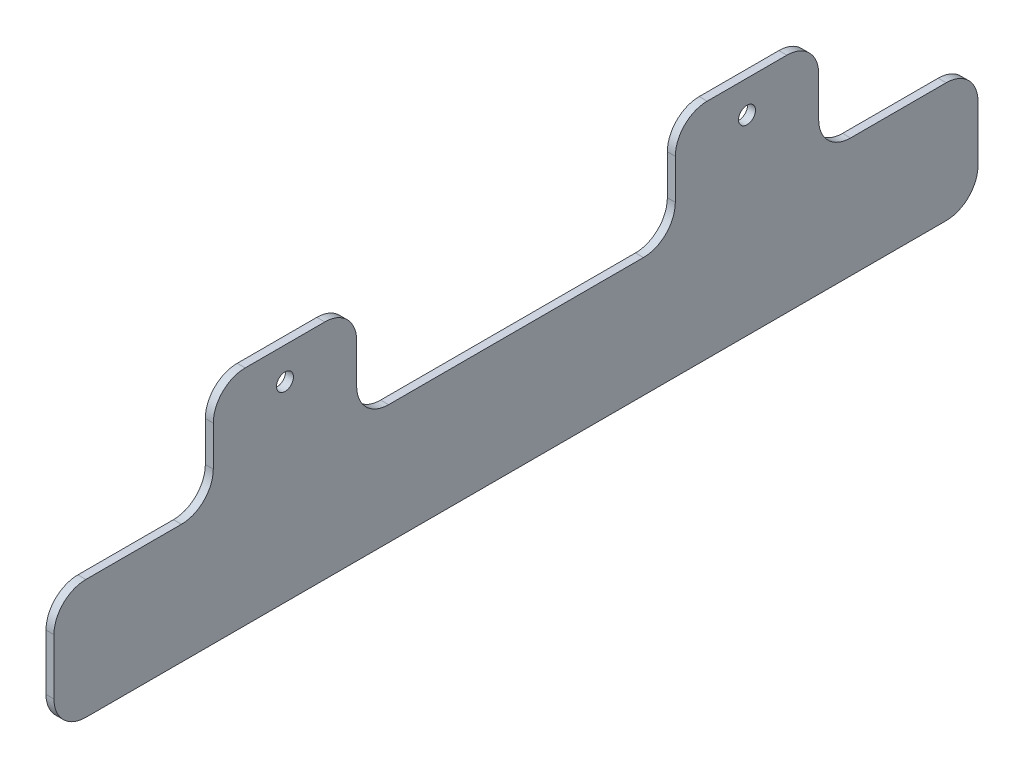
ISO-10303-21;
HEADER;
FILE_DESCRIPTION(('STEP AP214'),'2;1');
FILE_NAME('part.step','',(''),(''),'','','');
FILE_SCHEMA(('AUTOMOTIVE_DESIGN { 1 0 10303 214 1 1 1 1 }'));
ENDSEC;
DATA;
#1=APPLICATION_CONTEXT('core data for automotive mechanical design processes');
#2=APPLICATION_PROTOCOL_DEFINITION('international standard','automotive_design',2000,#1);
#3=PRODUCT_CONTEXT('',#1,'mechanical');
#4=PRODUCT('Part','Part','',(#3));
#5=PRODUCT_RELATED_PRODUCT_CATEGORY('part','',(#4));
#6=PRODUCT_DEFINITION_FORMATION('','',#4);
#7=PRODUCT_DEFINITION_CONTEXT('part definition',#1,'design');
#8=PRODUCT_DEFINITION('design','',#6,#7);
#9=PRODUCT_DEFINITION_SHAPE('','',#8);
#10=(LENGTH_UNIT() NAMED_UNIT(*) SI_UNIT(.MILLI.,.METRE.));
#11=(NAMED_UNIT(*) PLANE_ANGLE_UNIT() SI_UNIT($,.RADIAN.));
#12=(NAMED_UNIT(*) SI_UNIT($,.STERADIAN.) SOLID_ANGLE_UNIT());
#13=UNCERTAINTY_MEASURE_WITH_UNIT(LENGTH_MEASURE(1.E-05),#10,'distance_accuracy_value','');
#14=(GEOMETRIC_REPRESENTATION_CONTEXT(3) GLOBAL_UNCERTAINTY_ASSIGNED_CONTEXT((#13)) GLOBAL_UNIT_ASSIGNED_CONTEXT((#10,
#11,#12)) REPRESENTATION_CONTEXT('',''));
#15=CARTESIAN_POINT('',(0.,0.,0.));
#16=DIRECTION('',(0.,0.,1.));
#17=DIRECTION('',(1.,0.,0.));
#18=AXIS2_PLACEMENT_3D('',#15,#16,#17);
#19=CARTESIAN_POINT('',(3.175,12.7,-12.7));
#20=DIRECTION('',(-1.,0.,0.));
#21=DIRECTION('',(0.,0.,1.));
#22=AXIS2_PLACEMENT_3D('',#19,#20,#21);
#23=PLANE('',#22);
#24=CARTESIAN_POINT('',(3.175,12.7,-12.7));
#25=DIRECTION('',(1.,0.,0.));
#26=DIRECTION('',(0.,0.,1.));
#27=AXIS2_PLACEMENT_3D('',#24,#25,#26);
#28=CIRCLE('',#27,12.7);
#29=CARTESIAN_POINT('',(3.175,12.7,0.));
#30=VERTEX_POINT('',#29);
#31=CARTESIAN_POINT('',(3.175,0.,-12.7));
#32=VERTEX_POINT('',#31);
#33=EDGE_CURVE('E306',#30,#32,#28,.T.);
#34=ORIENTED_EDGE('',*,*,#33,.T.);
#35=DIRECTION('',(0.,0.,-1.));
#36=VECTOR('',#35,1.);
#37=CARTESIAN_POINT('',(3.175,0.,-12.7));
#38=LINE('',#37,#36);
#39=CARTESIAN_POINT('',(3.175,0.,-355.6));
#40=VERTEX_POINT('',#39);
#41=EDGE_CURVE('E145',#32,#40,#38,.T.);
#42=ORIENTED_EDGE('',*,*,#41,.T.);
#43=CARTESIAN_POINT('',(3.175,12.7,-355.6));
#44=DIRECTION('',(1.,0.,0.));
#45=DIRECTION('',(0.,0.,-1.));
#46=AXIS2_PLACEMENT_3D('',#43,#44,#45);
#47=CIRCLE('',#46,12.7);
#48=CARTESIAN_POINT('',(3.175,12.7,-368.3));
#49=VERTEX_POINT('',#48);
#50=EDGE_CURVE('E392',#40,#49,#47,.T.);
#51=ORIENTED_EDGE('',*,*,#50,.T.);
#52=DIRECTION('',(0.,1.,0.));
#53=VECTOR('',#52,1.);
#54=CARTESIAN_POINT('',(3.175,12.7,-368.3));
#55=LINE('',#54,#53);
#56=CARTESIAN_POINT('',(3.175,34.9250000000001,-368.3));
#57=VERTEX_POINT('',#56);
#58=EDGE_CURVE('E412',#49,#57,#55,.T.);
#59=ORIENTED_EDGE('',*,*,#58,.T.);
#60=CARTESIAN_POINT('',(3.175,34.9250000000001,-355.6));
#61=DIRECTION('',(1.,0.,0.));
#62=DIRECTION('',(0.,0.,-1.));
#63=AXIS2_PLACEMENT_3D('',#60,#61,#62);
#64=CIRCLE('',#63,12.7);
#65=CARTESIAN_POINT('',(3.175,47.625,-355.6));
#66=VERTEX_POINT('',#65);
#67=EDGE_CURVE('E408',#57,#66,#64,.T.);
#68=ORIENTED_EDGE('',*,*,#67,.T.);
#69=DIRECTION('',(0.,0.,1.));
#70=VECTOR('',#69,1.);
#71=CARTESIAN_POINT('',(3.175,47.6250000000001,-355.6));
#72=LINE('',#71,#70);
#73=CARTESIAN_POINT('',(3.175,47.6250000000001,-317.5));
#74=VERTEX_POINT('',#73);
#75=EDGE_CURVE('E411',#66,#74,#72,.T.);
#76=ORIENTED_EDGE('',*,*,#75,.T.);
#77=CARTESIAN_POINT('',(3.175,60.3250000000001,-317.5));
#78=DIRECTION('',(-1.,0.,0.));
#79=DIRECTION('',(0.,0.,1.));
#80=AXIS2_PLACEMENT_3D('',#77,#78,#79);
#81=CIRCLE('',#80,12.7);
#82=CARTESIAN_POINT('',(3.175,60.3250000000001,-304.8));
#83=VERTEX_POINT('',#82);
#84=EDGE_CURVE('E417',#74,#83,#81,.T.);
#85=ORIENTED_EDGE('',*,*,#84,.T.);
#86=DIRECTION('',(0.,1.,0.));
#87=VECTOR('',#86,1.);
#88=CARTESIAN_POINT('',(3.175,60.3250000000001,-304.8));
#89=LINE('',#88,#87);
#90=CARTESIAN_POINT('',(3.175,76.2,-304.8));
#91=VERTEX_POINT('',#90);
#92=EDGE_CURVE('E424',#83,#91,#89,.T.);
#93=ORIENTED_EDGE('',*,*,#92,.T.);
#94=CARTESIAN_POINT('',(3.175,76.2,-292.1));
#95=DIRECTION('',(1.,0.,0.));
#96=DIRECTION('',(0.,0.,-1.));
#97=AXIS2_PLACEMENT_3D('',#94,#95,#96);
#98=CIRCLE('',#97,12.7);
#99=CARTESIAN_POINT('',(3.175,88.9,-292.1));
#100=VERTEX_POINT('',#99);
#101=EDGE_CURVE('E427',#91,#100,#98,.T.);
#102=ORIENTED_EDGE('',*,*,#101,.T.);
#103=DIRECTION('',(0.,0.,1.));
#104=VECTOR('',#103,1.);
#105=CARTESIAN_POINT('',(3.175,88.9,-292.1));
#106=LINE('',#105,#104);
#107=CARTESIAN_POINT('',(3.175,88.9,-260.35));
#108=VERTEX_POINT('',#107);
#109=EDGE_CURVE('E430',#100,#108,#106,.T.);
#110=ORIENTED_EDGE('',*,*,#109,.T.);
#111=CARTESIAN_POINT('',(3.175,76.2,-260.35));
#112=DIRECTION('',(1.,0.,0.));
#113=DIRECTION('',(0.,0.,-1.));
#114=AXIS2_PLACEMENT_3D('',#111,#112,#113);
#115=CIRCLE('',#114,12.7);
#116=CARTESIAN_POINT('',(3.175,76.2,-247.65));
#117=VERTEX_POINT('',#116);
#118=EDGE_CURVE('E433',#108,#117,#115,.T.);
#119=ORIENTED_EDGE('',*,*,#118,.T.);
#120=DIRECTION('',(0.,-1.,0.));
#121=VECTOR('',#120,1.);
#122=CARTESIAN_POINT('',(3.175,76.2,-247.65));
#123=LINE('',#122,#121);
#124=CARTESIAN_POINT('',(3.175,60.3250000000001,-247.65));
#125=VERTEX_POINT('',#124);
#126=EDGE_CURVE('E436',#117,#125,#123,.T.);
#127=ORIENTED_EDGE('',*,*,#126,.T.);
#128=CARTESIAN_POINT('',(3.175,60.325,-234.95));
#129=DIRECTION('',(-1.,0.,0.));
#130=DIRECTION('',(0.,0.,1.));
#131=AXIS2_PLACEMENT_3D('',#128,#129,#130);
#132=CIRCLE('',#131,12.7);
#133=CARTESIAN_POINT('',(3.175,47.625,-234.95));
#134=VERTEX_POINT('',#133);
#135=EDGE_CURVE('E439',#125,#134,#132,.T.);
#136=ORIENTED_EDGE('',*,*,#135,.T.);
#137=DIRECTION('',(0.,0.,1.));
#138=VECTOR('',#137,1.);
#139=CARTESIAN_POINT('',(3.175,47.625,-133.35));
#140=LINE('',#139,#138);
#141=CARTESIAN_POINT('',(3.175,47.625,-133.35));
#142=VERTEX_POINT('',#141);
#143=EDGE_CURVE('E442',#134,#142,#140,.T.);
#144=ORIENTED_EDGE('',*,*,#143,.T.);
#145=CARTESIAN_POINT('',(3.175,60.325,-133.35));
#146=DIRECTION('',(-1.,0.,0.));
#147=DIRECTION('',(0.,0.,-1.));
#148=AXIS2_PLACEMENT_3D('',#145,#146,#147);
#149=CIRCLE('',#148,12.7);
#150=CARTESIAN_POINT('',(3.175,60.3250000000001,-120.65));
#151=VERTEX_POINT('',#150);
#152=EDGE_CURVE('E445',#142,#151,#149,.T.);
#153=ORIENTED_EDGE('',*,*,#152,.T.);
#154=DIRECTION('',(0.,1.,0.));
#155=VECTOR('',#154,1.);
#156=CARTESIAN_POINT('',(3.175,76.1999999999999,-120.65));
#157=LINE('',#156,#155);
#158=CARTESIAN_POINT('',(3.175,76.1999999999999,-120.65));
#159=VERTEX_POINT('',#158);
#160=EDGE_CURVE('E448',#151,#159,#157,.T.);
#161=ORIENTED_EDGE('',*,*,#160,.T.);
#162=CARTESIAN_POINT('',(3.175,76.2,-107.95));
#163=DIRECTION('',(1.,0.,0.));
#164=DIRECTION('',(0.,0.,-1.));
#165=AXIS2_PLACEMENT_3D('',#162,#163,#164);
#166=CIRCLE('',#165,12.7);
#167=CARTESIAN_POINT('',(3.175,88.9,-107.95));
#168=VERTEX_POINT('',#167);
#169=EDGE_CURVE('E451',#159,#168,#166,.T.);
#170=ORIENTED_EDGE('',*,*,#169,.T.);
#171=DIRECTION('',(0.,0.,1.));
#172=VECTOR('',#171,1.);
#173=CARTESIAN_POINT('',(3.175,88.9,-107.95));
#174=LINE('',#173,#172);
#175=CARTESIAN_POINT('',(3.175,88.9,-76.2));
#176=VERTEX_POINT('',#175);
#177=EDGE_CURVE('E454',#168,#176,#174,.T.);
#178=ORIENTED_EDGE('',*,*,#177,.T.);
#179=CARTESIAN_POINT('',(3.175,76.2,-76.2));
#180=DIRECTION('',(1.,0.,0.));
#181=DIRECTION('',(0.,0.,-1.));
#182=AXIS2_PLACEMENT_3D('',#179,#180,#181);
#183=CIRCLE('',#182,12.7);
#184=CARTESIAN_POINT('',(3.175,76.2,-63.5));
#185=VERTEX_POINT('',#184);
#186=EDGE_CURVE('E457',#176,#185,#183,.T.);
#187=ORIENTED_EDGE('',*,*,#186,.T.);
#188=DIRECTION('',(0.,-1.,0.));
#189=VECTOR('',#188,1.);
#190=CARTESIAN_POINT('',(3.175,76.2,-63.5));
#191=LINE('',#190,#189);
#192=CARTESIAN_POINT('',(3.175,60.325,-63.5));
#193=VERTEX_POINT('',#192);
#194=EDGE_CURVE('E460',#185,#193,#191,.T.);
#195=ORIENTED_EDGE('',*,*,#194,.T.);
#196=CARTESIAN_POINT('',(3.175,60.325,-50.8));
#197=DIRECTION('',(-1.,0.,0.));
#198=DIRECTION('',(0.,0.,1.));
#199=AXIS2_PLACEMENT_3D('',#196,#197,#198);
#200=CIRCLE('',#199,12.7);
#201=CARTESIAN_POINT('',(3.175,47.625,-50.8));
#202=VERTEX_POINT('',#201);
#203=EDGE_CURVE('E212',#193,#202,#200,.T.);
#204=ORIENTED_EDGE('',*,*,#203,.T.);
#205=DIRECTION('',(0.,0.,1.));
#206=VECTOR('',#205,1.);
#207=CARTESIAN_POINT('',(3.175,47.625,-50.8));
#208=LINE('',#207,#206);
#209=CARTESIAN_POINT('',(3.175,47.625,-12.7));
#210=VERTEX_POINT('',#209);
#211=EDGE_CURVE('E206',#202,#210,#208,.T.);
#212=ORIENTED_EDGE('',*,*,#211,.T.);
#213=CARTESIAN_POINT('',(3.175,34.925,-12.7));
#214=DIRECTION('',(1.,0.,0.));
#215=DIRECTION('',(0.,0.,-1.));
#216=AXIS2_PLACEMENT_3D('',#213,#214,#215);
#217=CIRCLE('',#216,12.7);
#218=CARTESIAN_POINT('',(3.175,34.925,0.));
#219=VERTEX_POINT('',#218);
#220=EDGE_CURVE('E210',#210,#219,#217,.T.);
#221=ORIENTED_EDGE('',*,*,#220,.T.);
#222=DIRECTION('',(0.,-1.,0.));
#223=VECTOR('',#222,1.);
#224=CARTESIAN_POINT('',(3.175,34.925,0.));
#225=LINE('',#224,#223);
#226=EDGE_CURVE('E54',#219,#30,#225,.T.);
#227=ORIENTED_EDGE('',*,*,#226,.T.);
#228=EDGE_LOOP('',(#34,#42,#51,#59,#68,#76,#85,#93,#102,#110,#119,#127,#136,#144,#153,#161,#170,
#178,#187,#195,#204,#212,#221,#227));
#229=FACE_BOUND('',#228,.T.);
#230=CARTESIAN_POINT('',(3.175,76.2,-92.075));
#231=DIRECTION('',(1.,0.,0.));
#232=DIRECTION('',(0.,0.,-1.));
#233=AXIS2_PLACEMENT_3D('',#230,#231,#232);
#234=CIRCLE('',#233,3.37343749999999);
#235=CARTESIAN_POINT('',(3.175,76.2,-95.4484375));
#236=VERTEX_POINT('',#235);
#237=EDGE_CURVE('E240',#236,#236,#234,.T.);
#238=ORIENTED_EDGE('',*,*,#237,.F.);
#239=EDGE_LOOP('',(#238));
#240=FACE_BOUND('',#239,.T.);
#241=CARTESIAN_POINT('',(3.175,76.2,-276.225));
#242=DIRECTION('',(1.,0.,0.));
#243=DIRECTION('',(0.,0.,-1.));
#244=AXIS2_PLACEMENT_3D('',#241,#242,#243);
#245=CIRCLE('',#244,3.37343750000003);
#246=CARTESIAN_POINT('',(3.175,76.2,-279.5984375));
#247=VERTEX_POINT('',#246);
#248=EDGE_CURVE('E520',#247,#247,#245,.T.);
#249=ORIENTED_EDGE('',*,*,#248,.F.);
#250=EDGE_LOOP('',(#249));
#251=FACE_BOUND('',#250,.T.);
#252=ADVANCED_FACE('F36',(#229,#240,#251),#23,.F.);
#253=CARTESIAN_POINT('',(0.,12.7,-12.7));
#254=DIRECTION('',(-1.,0.,0.));
#255=DIRECTION('',(0.,0.,1.));
#256=AXIS2_PLACEMENT_3D('',#253,#254,#255);
#257=PLANE('',#256);
#258=CARTESIAN_POINT('',(0.,76.2,-92.075));
#259=DIRECTION('',(1.,0.,0.));
#260=DIRECTION('',(0.,0.,-1.));
#261=AXIS2_PLACEMENT_3D('',#258,#259,#260);
#262=CIRCLE('',#261,3.37343749999999);
#263=CARTESIAN_POINT('',(0.,76.2,-95.4484375));
#264=VERTEX_POINT('',#263);
#265=EDGE_CURVE('E528',#264,#264,#262,.T.);
#266=ORIENTED_EDGE('',*,*,#265,.T.);
#267=EDGE_LOOP('',(#266));
#268=FACE_BOUND('',#267,.T.);
#269=CARTESIAN_POINT('',(0.,12.7,-12.7));
#270=DIRECTION('',(1.,0.,0.));
#271=DIRECTION('',(0.,0.,1.));
#272=AXIS2_PLACEMENT_3D('',#269,#270,#271);
#273=CIRCLE('',#272,12.7);
#274=CARTESIAN_POINT('',(0.,12.7,0.));
#275=VERTEX_POINT('',#274);
#276=CARTESIAN_POINT('',(0.,0.,-12.7));
#277=VERTEX_POINT('',#276);
#278=EDGE_CURVE('E235',#275,#277,#273,.T.);
#279=ORIENTED_EDGE('',*,*,#278,.F.);
#280=DIRECTION('',(0.,-1.,0.));
#281=VECTOR('',#280,1.);
#282=CARTESIAN_POINT('',(0.,34.925,0.));
#283=LINE('',#282,#281);
#284=CARTESIAN_POINT('',(0.,34.925,0.));
#285=VERTEX_POINT('',#284);
#286=EDGE_CURVE('E137',#285,#275,#283,.T.);
#287=ORIENTED_EDGE('',*,*,#286,.F.);
#288=CARTESIAN_POINT('',(0.,34.925,-12.7));
#289=DIRECTION('',(1.,0.,0.));
#290=DIRECTION('',(0.,0.,-1.));
#291=AXIS2_PLACEMENT_3D('',#288,#289,#290);
#292=CIRCLE('',#291,12.7);
#293=CARTESIAN_POINT('',(0.,47.625,-12.7));
#294=VERTEX_POINT('',#293);
#295=EDGE_CURVE('E131',#294,#285,#292,.T.);
#296=ORIENTED_EDGE('',*,*,#295,.F.);
#297=DIRECTION('',(0.,0.,1.));
#298=VECTOR('',#297,1.);
#299=CARTESIAN_POINT('',(0.,47.625,-50.8));
#300=LINE('',#299,#298);
#301=CARTESIAN_POINT('',(0.,47.625,-50.8));
#302=VERTEX_POINT('',#301);
#303=EDGE_CURVE('E221',#302,#294,#300,.T.);
#304=ORIENTED_EDGE('',*,*,#303,.F.);
#305=CARTESIAN_POINT('',(0.,60.325,-50.8));
#306=DIRECTION('',(-1.,0.,0.));
#307=DIRECTION('',(0.,0.,1.));
#308=AXIS2_PLACEMENT_3D('',#305,#306,#307);
#309=CIRCLE('',#308,12.7);
#310=CARTESIAN_POINT('',(0.,60.325,-63.5));
#311=VERTEX_POINT('',#310);
#312=EDGE_CURVE('E297',#311,#302,#309,.T.);
#313=ORIENTED_EDGE('',*,*,#312,.F.);
#314=DIRECTION('',(0.,-1.,0.));
#315=VECTOR('',#314,1.);
#316=CARTESIAN_POINT('',(0.,76.2,-63.5));
#317=LINE('',#316,#315);
#318=CARTESIAN_POINT('',(0.,76.2,-63.5));
#319=VERTEX_POINT('',#318);
#320=EDGE_CURVE('E294',#319,#311,#317,.T.);
#321=ORIENTED_EDGE('',*,*,#320,.F.);
#322=CARTESIAN_POINT('',(0.,76.2,-76.2));
#323=DIRECTION('',(1.,0.,0.));
#324=DIRECTION('',(0.,0.,-1.));
#325=AXIS2_PLACEMENT_3D('',#322,#323,#324);
#326=CIRCLE('',#325,12.7);
#327=CARTESIAN_POINT('',(0.,88.9,-76.2));
#328=VERTEX_POINT('',#327);
#329=EDGE_CURVE('E291',#328,#319,#326,.T.);
#330=ORIENTED_EDGE('',*,*,#329,.F.);
#331=DIRECTION('',(0.,0.,1.));
#332=VECTOR('',#331,1.);
#333=CARTESIAN_POINT('',(0.,88.9,-107.95));
#334=LINE('',#333,#332);
#335=CARTESIAN_POINT('',(0.,88.9,-107.95));
#336=VERTEX_POINT('',#335);
#337=EDGE_CURVE('E288',#336,#328,#334,.T.);
#338=ORIENTED_EDGE('',*,*,#337,.F.);
#339=CARTESIAN_POINT('',(0.,76.2,-107.95));
#340=DIRECTION('',(1.,0.,0.));
#341=DIRECTION('',(0.,0.,-1.));
#342=AXIS2_PLACEMENT_3D('',#339,#340,#341);
#343=CIRCLE('',#342,12.7);
#344=CARTESIAN_POINT('',(0.,76.1999999999999,-120.65));
#345=VERTEX_POINT('',#344);
#346=EDGE_CURVE('E285',#345,#336,#343,.T.);
#347=ORIENTED_EDGE('',*,*,#346,.F.);
#348=DIRECTION('',(0.,1.,0.));
#349=VECTOR('',#348,1.);
#350=CARTESIAN_POINT('',(0.,76.1999999999999,-120.65));
#351=LINE('',#350,#349);
#352=CARTESIAN_POINT('',(0.,60.3250000000001,-120.65));
#353=VERTEX_POINT('',#352);
#354=EDGE_CURVE('E282',#353,#345,#351,.T.);
#355=ORIENTED_EDGE('',*,*,#354,.F.);
#356=CARTESIAN_POINT('',(0.,60.325,-133.35));
#357=DIRECTION('',(-1.,0.,0.));
#358=DIRECTION('',(0.,0.,-1.));
#359=AXIS2_PLACEMENT_3D('',#356,#357,#358);
#360=CIRCLE('',#359,12.7);
#361=CARTESIAN_POINT('',(0.,47.625,-133.35));
#362=VERTEX_POINT('',#361);
#363=EDGE_CURVE('E279',#362,#353,#360,.T.);
#364=ORIENTED_EDGE('',*,*,#363,.F.);
#365=DIRECTION('',(0.,0.,1.));
#366=VECTOR('',#365,1.);
#367=CARTESIAN_POINT('',(0.,47.625,-133.35));
#368=LINE('',#367,#366);
#369=CARTESIAN_POINT('',(0.,47.625,-234.95));
#370=VERTEX_POINT('',#369);
#371=EDGE_CURVE('E276',#370,#362,#368,.T.);
#372=ORIENTED_EDGE('',*,*,#371,.F.);
#373=CARTESIAN_POINT('',(0.,60.325,-234.95));
#374=DIRECTION('',(-1.,0.,0.));
#375=DIRECTION('',(0.,0.,1.));
#376=AXIS2_PLACEMENT_3D('',#373,#374,#375);
#377=CIRCLE('',#376,12.7);
#378=CARTESIAN_POINT('',(0.,60.3250000000001,-247.65));
#379=VERTEX_POINT('',#378);
#380=EDGE_CURVE('E273',#379,#370,#377,.T.);
#381=ORIENTED_EDGE('',*,*,#380,.F.);
#382=DIRECTION('',(0.,-1.,0.));
#383=VECTOR('',#382,1.);
#384=CARTESIAN_POINT('',(0.,76.2,-247.65));
#385=LINE('',#384,#383);
#386=CARTESIAN_POINT('',(0.,76.2,-247.65));
#387=VERTEX_POINT('',#386);
#388=EDGE_CURVE('E270',#387,#379,#385,.T.);
#389=ORIENTED_EDGE('',*,*,#388,.F.);
#390=CARTESIAN_POINT('',(0.,76.2,-260.35));
#391=DIRECTION('',(1.,0.,0.));
#392=DIRECTION('',(0.,0.,-1.));
#393=AXIS2_PLACEMENT_3D('',#390,#391,#392);
#394=CIRCLE('',#393,12.7);
#395=CARTESIAN_POINT('',(0.,88.9,-260.35));
#396=VERTEX_POINT('',#395);
#397=EDGE_CURVE('E267',#396,#387,#394,.T.);
#398=ORIENTED_EDGE('',*,*,#397,.F.);
#399=DIRECTION('',(0.,0.,1.));
#400=VECTOR('',#399,1.);
#401=CARTESIAN_POINT('',(0.,88.9,-292.1));
#402=LINE('',#401,#400);
#403=CARTESIAN_POINT('',(0.,88.9,-292.1));
#404=VERTEX_POINT('',#403);
#405=EDGE_CURVE('E264',#404,#396,#402,.T.);
#406=ORIENTED_EDGE('',*,*,#405,.F.);
#407=CARTESIAN_POINT('',(0.,76.2,-292.1));
#408=DIRECTION('',(1.,0.,0.));
#409=DIRECTION('',(0.,0.,-1.));
#410=AXIS2_PLACEMENT_3D('',#407,#408,#409);
#411=CIRCLE('',#410,12.7);
#412=CARTESIAN_POINT('',(0.,76.2,-304.8));
#413=VERTEX_POINT('',#412);
#414=EDGE_CURVE('E261',#413,#404,#411,.T.);
#415=ORIENTED_EDGE('',*,*,#414,.F.);
#416=DIRECTION('',(0.,1.,0.));
#417=VECTOR('',#416,1.);
#418=CARTESIAN_POINT('',(0.,60.3250000000001,-304.8));
#419=LINE('',#418,#417);
#420=CARTESIAN_POINT('',(0.,60.3250000000001,-304.8));
#421=VERTEX_POINT('',#420);
#422=EDGE_CURVE('E258',#421,#413,#419,.T.);
#423=ORIENTED_EDGE('',*,*,#422,.F.);
#424=CARTESIAN_POINT('',(0.,60.3250000000001,-317.5));
#425=DIRECTION('',(-1.,0.,0.));
#426=DIRECTION('',(0.,0.,1.));
#427=AXIS2_PLACEMENT_3D('',#424,#425,#426);
#428=CIRCLE('',#427,12.7);
#429=CARTESIAN_POINT('',(0.,47.6250000000001,-317.5));
#430=VERTEX_POINT('',#429);
#431=EDGE_CURVE('E255',#430,#421,#428,.T.);
#432=ORIENTED_EDGE('',*,*,#431,.F.);
#433=DIRECTION('',(0.,0.,1.));
#434=VECTOR('',#433,1.);
#435=CARTESIAN_POINT('',(0.,47.6250000000001,-355.6));
#436=LINE('',#435,#434);
#437=CARTESIAN_POINT('',(0.,47.625,-355.6));
#438=VERTEX_POINT('',#437);
#439=EDGE_CURVE('E252',#438,#430,#436,.T.);
#440=ORIENTED_EDGE('',*,*,#439,.F.);
#441=CARTESIAN_POINT('',(0.,34.9250000000001,-355.6));
#442=DIRECTION('',(1.,0.,0.));
#443=DIRECTION('',(0.,0.,-1.));
#444=AXIS2_PLACEMENT_3D('',#441,#442,#443);
#445=CIRCLE('',#444,12.7);
#446=CARTESIAN_POINT('',(0.,34.9250000000001,-368.3));
#447=VERTEX_POINT('',#446);
#448=EDGE_CURVE('E249',#447,#438,#445,.T.);
#449=ORIENTED_EDGE('',*,*,#448,.F.);
#450=DIRECTION('',(0.,1.,0.));
#451=VECTOR('',#450,1.);
#452=CARTESIAN_POINT('',(0.,12.7,-368.3));
#453=LINE('',#452,#451);
#454=CARTESIAN_POINT('',(0.,12.7,-368.3));
#455=VERTEX_POINT('',#454);
#456=EDGE_CURVE('E246',#455,#447,#453,.T.);
#457=ORIENTED_EDGE('',*,*,#456,.F.);
#458=CARTESIAN_POINT('',(0.,12.7,-355.6));
#459=DIRECTION('',(1.,0.,0.));
#460=DIRECTION('',(0.,0.,-1.));
#461=AXIS2_PLACEMENT_3D('',#458,#459,#460);
#462=CIRCLE('',#461,12.7);
#463=CARTESIAN_POINT('',(0.,0.,-355.6));
#464=VERTEX_POINT('',#463);
#465=EDGE_CURVE('E243',#464,#455,#462,.T.);
#466=ORIENTED_EDGE('',*,*,#465,.F.);
#467=DIRECTION('',(0.,0.,-1.));
#468=VECTOR('',#467,1.);
#469=CARTESIAN_POINT('',(0.,0.,-12.7));
#470=LINE('',#469,#468);
#471=EDGE_CURVE('E239',#277,#464,#470,.T.);
#472=ORIENTED_EDGE('',*,*,#471,.F.);
#473=EDGE_LOOP('',(#279,#287,#296,#304,#313,#321,#330,#338,#347,#355,#364,#372,#381,#389,#398,
#406,#415,#423,#432,#440,#449,#457,#466,#472));
#474=FACE_BOUND('',#473,.T.);
#475=CARTESIAN_POINT('',(0.,76.2,-276.225));
#476=DIRECTION('',(1.,0.,0.));
#477=DIRECTION('',(0.,0.,-1.));
#478=AXIS2_PLACEMENT_3D('',#475,#476,#477);
#479=CIRCLE('',#478,3.37343750000003);
#480=CARTESIAN_POINT('',(0.,76.2,-279.5984375));
#481=VERTEX_POINT('',#480);
#482=EDGE_CURVE('E523',#481,#481,#479,.T.);
#483=ORIENTED_EDGE('',*,*,#482,.T.);
#484=EDGE_LOOP('',(#483));
#485=FACE_BOUND('',#484,.T.);
#486=ADVANCED_FACE('F396',(#268,#474,#485),#257,.T.);
#487=CARTESIAN_POINT('',(3.175,12.7,-12.7));
#488=DIRECTION('',(-1.,0.,0.));
#489=DIRECTION('',(0.,0.,1.));
#490=AXIS2_PLACEMENT_3D('',#487,#488,#489);
#491=CYLINDRICAL_SURFACE('',#490,12.7);
#492=ORIENTED_EDGE('',*,*,#278,.T.);
#493=DIRECTION('',(-1.,0.,0.));
#494=VECTOR('',#493,1.);
#495=CARTESIAN_POINT('',(3.175,0.,-12.7));
#496=LINE('',#495,#494);
#497=EDGE_CURVE('E11',#32,#277,#496,.T.);
#498=ORIENTED_EDGE('',*,*,#497,.F.);
#499=ORIENTED_EDGE('',*,*,#33,.F.);
#500=DIRECTION('',(-1.,0.,0.));
#501=VECTOR('',#500,1.);
#502=CARTESIAN_POINT('',(3.175,12.7,0.));
#503=LINE('',#502,#501);
#504=EDGE_CURVE('E231',#30,#275,#503,.T.);
#505=ORIENTED_EDGE('',*,*,#504,.T.);
#506=EDGE_LOOP('',(#492,#498,#499,#505));
#507=FACE_BOUND('',#506,.T.);
#508=ADVANCED_FACE('F38',(#507),#491,.T.);
#509=CARTESIAN_POINT('',(3.175,0.,-12.7));
#510=DIRECTION('',(0.,1.,0.));
#511=DIRECTION('',(0.,0.,1.));
#512=AXIS2_PLACEMENT_3D('',#509,#510,#511);
#513=PLANE('',#512);
#514=ORIENTED_EDGE('',*,*,#471,.T.);
#515=DIRECTION('',(-1.,0.,0.));
#516=VECTOR('',#515,1.);
#517=CARTESIAN_POINT('',(3.175,0.,-355.6));
#518=LINE('',#517,#516);
#519=EDGE_CURVE('E46',#40,#464,#518,.T.);
#520=ORIENTED_EDGE('',*,*,#519,.F.);
#521=ORIENTED_EDGE('',*,*,#41,.F.);
#522=ORIENTED_EDGE('',*,*,#497,.T.);
#523=EDGE_LOOP('',(#514,#520,#521,#522));
#524=FACE_BOUND('',#523,.T.);
#525=ADVANCED_FACE('F779',(#524),#513,.F.);
#526=CARTESIAN_POINT('',(3.175,12.7,-355.6));
#527=DIRECTION('',(-1.,0.,0.));
#528=DIRECTION('',(0.,0.,1.));
#529=AXIS2_PLACEMENT_3D('',#526,#527,#528);
#530=CYLINDRICAL_SURFACE('',#529,12.7);
#531=ORIENTED_EDGE('',*,*,#465,.T.);
#532=DIRECTION('',(-1.,0.,0.));
#533=VECTOR('',#532,1.);
#534=CARTESIAN_POINT('',(3.175,12.7,-368.3));
#535=LINE('',#534,#533);
#536=EDGE_CURVE('E381',#49,#455,#535,.T.);
#537=ORIENTED_EDGE('',*,*,#536,.F.);
#538=ORIENTED_EDGE('',*,*,#50,.F.);
#539=ORIENTED_EDGE('',*,*,#519,.T.);
#540=EDGE_LOOP('',(#531,#537,#538,#539));
#541=FACE_BOUND('',#540,.T.);
#542=ADVANCED_FACE('F390',(#541),#530,.T.);
#543=CARTESIAN_POINT('',(3.175,12.7,-368.3));
#544=DIRECTION('',(0.,0.,1.));
#545=DIRECTION('',(0.,-1.,0.));
#546=AXIS2_PLACEMENT_3D('',#543,#544,#545);
#547=PLANE('',#546);
#548=ORIENTED_EDGE('',*,*,#456,.T.);
#549=DIRECTION('',(-1.,0.,0.));
#550=VECTOR('',#549,1.);
#551=CARTESIAN_POINT('',(3.175,34.9250000000001,-368.3));
#552=LINE('',#551,#550);
#553=EDGE_CURVE('E377',#57,#447,#552,.T.);
#554=ORIENTED_EDGE('',*,*,#553,.F.);
#555=ORIENTED_EDGE('',*,*,#58,.F.);
#556=ORIENTED_EDGE('',*,*,#536,.T.);
#557=EDGE_LOOP('',(#548,#554,#555,#556));
#558=FACE_BOUND('',#557,.T.);
#559=ADVANCED_FACE('F402',(#558),#547,.F.);
#560=CARTESIAN_POINT('',(3.175,34.9250000000001,-355.6));
#561=DIRECTION('',(-1.,0.,0.));
#562=DIRECTION('',(0.,0.,1.));
#563=AXIS2_PLACEMENT_3D('',#560,#561,#562);
#564=CYLINDRICAL_SURFACE('',#563,12.7);
#565=ORIENTED_EDGE('',*,*,#448,.T.);
#566=DIRECTION('',(-1.,0.,0.));
#567=VECTOR('',#566,1.);
#568=CARTESIAN_POINT('',(3.175,47.625,-355.6));
#569=LINE('',#568,#567);
#570=EDGE_CURVE('E373',#66,#438,#569,.T.);
#571=ORIENTED_EDGE('',*,*,#570,.F.);
#572=ORIENTED_EDGE('',*,*,#67,.F.);
#573=ORIENTED_EDGE('',*,*,#553,.T.);
#574=EDGE_LOOP('',(#565,#571,#572,#573));
#575=FACE_BOUND('',#574,.T.);
#576=ADVANCED_FACE('F406',(#575),#564,.T.);
#577=CARTESIAN_POINT('',(3.175,47.6250000000001,-355.6));
#578=DIRECTION('',(0.,-1.,0.));
#579=DIRECTION('',(0.,0.,-1.));
#580=AXIS2_PLACEMENT_3D('',#577,#578,#579);
#581=PLANE('',#580);
#582=ORIENTED_EDGE('',*,*,#439,.T.);
#583=DIRECTION('',(-1.,0.,0.));
#584=VECTOR('',#583,1.);
#585=CARTESIAN_POINT('',(3.175,47.6250000000001,-317.5));
#586=LINE('',#585,#584);
#587=EDGE_CURVE('E369',#74,#430,#586,.T.);
#588=ORIENTED_EDGE('',*,*,#587,.F.);
#589=ORIENTED_EDGE('',*,*,#75,.F.);
#590=ORIENTED_EDGE('',*,*,#570,.T.);
#591=EDGE_LOOP('',(#582,#588,#589,#590));
#592=FACE_BOUND('',#591,.T.);
#593=ADVANCED_FACE('F744',(#592),#581,.F.);
#594=CARTESIAN_POINT('',(3.175,60.3250000000001,-317.5));
#595=DIRECTION('',(-1.,0.,0.));
#596=DIRECTION('',(0.,0.,1.));
#597=AXIS2_PLACEMENT_3D('',#594,#595,#596);
#598=CYLINDRICAL_SURFACE('',#597,12.7);
#599=ORIENTED_EDGE('',*,*,#431,.T.);
#600=DIRECTION('',(-1.,0.,0.));
#601=VECTOR('',#600,1.);
#602=CARTESIAN_POINT('',(3.175,60.3250000000001,-304.8));
#603=LINE('',#602,#601);
#604=EDGE_CURVE('E365',#83,#421,#603,.T.);
#605=ORIENTED_EDGE('',*,*,#604,.F.);
#606=ORIENTED_EDGE('',*,*,#84,.F.);
#607=ORIENTED_EDGE('',*,*,#587,.T.);
#608=EDGE_LOOP('',(#599,#605,#606,#607));
#609=FACE_BOUND('',#608,.T.);
#610=ADVANCED_FACE('F734',(#609),#598,.F.);
#611=CARTESIAN_POINT('',(3.175,60.3250000000001,-304.8));
#612=DIRECTION('',(0.,0.,1.));
#613=DIRECTION('',(1.,0.,0.));
#614=AXIS2_PLACEMENT_3D('',#611,#612,#613);
#615=PLANE('',#614);
#616=ORIENTED_EDGE('',*,*,#422,.T.);
#617=DIRECTION('',(-1.,0.,0.));
#618=VECTOR('',#617,1.);
#619=CARTESIAN_POINT('',(3.175,76.2,-304.8));
#620=LINE('',#619,#618);
#621=EDGE_CURVE('E361',#91,#413,#620,.T.);
#622=ORIENTED_EDGE('',*,*,#621,.F.);
#623=ORIENTED_EDGE('',*,*,#92,.F.);
#624=ORIENTED_EDGE('',*,*,#604,.T.);
#625=EDGE_LOOP('',(#616,#622,#623,#624));
#626=FACE_BOUND('',#625,.T.);
#627=ADVANCED_FACE('F724',(#626),#615,.F.);
#628=CARTESIAN_POINT('',(3.175,76.2,-292.1));
#629=DIRECTION('',(-1.,0.,0.));
#630=DIRECTION('',(0.,0.,1.));
#631=AXIS2_PLACEMENT_3D('',#628,#629,#630);
#632=CYLINDRICAL_SURFACE('',#631,12.7);
#633=ORIENTED_EDGE('',*,*,#414,.T.);
#634=DIRECTION('',(-1.,0.,0.));
#635=VECTOR('',#634,1.);
#636=CARTESIAN_POINT('',(3.175,88.9,-292.1));
#637=LINE('',#636,#635);
#638=EDGE_CURVE('E357',#100,#404,#637,.T.);
#639=ORIENTED_EDGE('',*,*,#638,.F.);
#640=ORIENTED_EDGE('',*,*,#101,.F.);
#641=ORIENTED_EDGE('',*,*,#621,.T.);
#642=EDGE_LOOP('',(#633,#639,#640,#641));
#643=FACE_BOUND('',#642,.T.);
#644=ADVANCED_FACE('F714',(#643),#632,.T.);
#645=CARTESIAN_POINT('',(3.175,88.9,-292.1));
#646=DIRECTION('',(0.,-1.,0.));
#647=DIRECTION('',(0.,0.,-1.));
#648=AXIS2_PLACEMENT_3D('',#645,#646,#647);
#649=PLANE('',#648);
#650=ORIENTED_EDGE('',*,*,#405,.T.);
#651=DIRECTION('',(-1.,0.,0.));
#652=VECTOR('',#651,1.);
#653=CARTESIAN_POINT('',(3.175,88.9,-260.35));
#654=LINE('',#653,#652);
#655=EDGE_CURVE('E353',#108,#396,#654,.T.);
#656=ORIENTED_EDGE('',*,*,#655,.F.);
#657=ORIENTED_EDGE('',*,*,#109,.F.);
#658=ORIENTED_EDGE('',*,*,#638,.T.);
#659=EDGE_LOOP('',(#650,#656,#657,#658));
#660=FACE_BOUND('',#659,.T.);
#661=ADVANCED_FACE('F704',(#660),#649,.F.);
#662=CARTESIAN_POINT('',(3.175,76.2,-260.35));
#663=DIRECTION('',(-1.,0.,0.));
#664=DIRECTION('',(0.,0.,1.));
#665=AXIS2_PLACEMENT_3D('',#662,#663,#664);
#666=CYLINDRICAL_SURFACE('',#665,12.7);
#667=ORIENTED_EDGE('',*,*,#397,.T.);
#668=DIRECTION('',(-1.,0.,0.));
#669=VECTOR('',#668,1.);
#670=CARTESIAN_POINT('',(3.175,76.2,-247.65));
#671=LINE('',#670,#669);
#672=EDGE_CURVE('E349',#117,#387,#671,.T.);
#673=ORIENTED_EDGE('',*,*,#672,.F.);
#674=ORIENTED_EDGE('',*,*,#118,.F.);
#675=ORIENTED_EDGE('',*,*,#655,.T.);
#676=EDGE_LOOP('',(#667,#673,#674,#675));
#677=FACE_BOUND('',#676,.T.);
#678=ADVANCED_FACE('F694',(#677),#666,.T.);
#679=CARTESIAN_POINT('',(3.175,76.2,-247.65));
#680=DIRECTION('',(0.,0.,-1.));
#681=DIRECTION('',(0.,1.,0.));
#682=AXIS2_PLACEMENT_3D('',#679,#680,#681);
#683=PLANE('',#682);
#684=ORIENTED_EDGE('',*,*,#388,.T.);
#685=DIRECTION('',(-1.,0.,0.));
#686=VECTOR('',#685,1.);
#687=CARTESIAN_POINT('',(3.175,60.3250000000001,-247.65));
#688=LINE('',#687,#686);
#689=EDGE_CURVE('E345',#125,#379,#688,.T.);
#690=ORIENTED_EDGE('',*,*,#689,.F.);
#691=ORIENTED_EDGE('',*,*,#126,.F.);
#692=ORIENTED_EDGE('',*,*,#672,.T.);
#693=EDGE_LOOP('',(#684,#690,#691,#692));
#694=FACE_BOUND('',#693,.T.);
#695=ADVANCED_FACE('F684',(#694),#683,.F.);
#696=CARTESIAN_POINT('',(3.175,60.325,-234.95));
#697=DIRECTION('',(-1.,0.,0.));
#698=DIRECTION('',(0.,0.,1.));
#699=AXIS2_PLACEMENT_3D('',#696,#697,#698);
#700=CYLINDRICAL_SURFACE('',#699,12.7);
#701=ORIENTED_EDGE('',*,*,#380,.T.);
#702=DIRECTION('',(-1.,0.,0.));
#703=VECTOR('',#702,1.);
#704=CARTESIAN_POINT('',(3.175,47.625,-234.95));
#705=LINE('',#704,#703);
#706=EDGE_CURVE('E341',#134,#370,#705,.T.);
#707=ORIENTED_EDGE('',*,*,#706,.F.);
#708=ORIENTED_EDGE('',*,*,#135,.F.);
#709=ORIENTED_EDGE('',*,*,#689,.T.);
#710=EDGE_LOOP('',(#701,#707,#708,#709));
#711=FACE_BOUND('',#710,.T.);
#712=ADVANCED_FACE('F674',(#711),#700,.F.);
#713=CARTESIAN_POINT('',(3.175,47.625,-133.35));
#714=DIRECTION('',(0.,-1.,0.));
#715=DIRECTION('',(0.,0.,-1.));
#716=AXIS2_PLACEMENT_3D('',#713,#714,#715);
#717=PLANE('',#716);
#718=ORIENTED_EDGE('',*,*,#371,.T.);
#719=DIRECTION('',(-1.,0.,0.));
#720=VECTOR('',#719,1.);
#721=CARTESIAN_POINT('',(3.175,47.625,-133.35));
#722=LINE('',#721,#720);
#723=EDGE_CURVE('E337',#142,#362,#722,.T.);
#724=ORIENTED_EDGE('',*,*,#723,.F.);
#725=ORIENTED_EDGE('',*,*,#143,.F.);
#726=ORIENTED_EDGE('',*,*,#706,.T.);
#727=EDGE_LOOP('',(#718,#724,#725,#726));
#728=FACE_BOUND('',#727,.T.);
#729=ADVANCED_FACE('F664',(#728),#717,.F.);
#730=CARTESIAN_POINT('',(3.175,60.325,-133.35));
#731=DIRECTION('',(-1.,0.,0.));
#732=DIRECTION('',(0.,0.,1.));
#733=AXIS2_PLACEMENT_3D('',#730,#731,#732);
#734=CYLINDRICAL_SURFACE('',#733,12.7);
#735=ORIENTED_EDGE('',*,*,#363,.T.);
#736=DIRECTION('',(-1.,0.,0.));
#737=VECTOR('',#736,1.);
#738=CARTESIAN_POINT('',(3.175,60.3250000000001,-120.65));
#739=LINE('',#738,#737);
#740=EDGE_CURVE('E333',#151,#353,#739,.T.);
#741=ORIENTED_EDGE('',*,*,#740,.F.);
#742=ORIENTED_EDGE('',*,*,#152,.F.);
#743=ORIENTED_EDGE('',*,*,#723,.T.);
#744=EDGE_LOOP('',(#735,#741,#742,#743));
#745=FACE_BOUND('',#744,.T.);
#746=ADVANCED_FACE('F654',(#745),#734,.F.);
#747=CARTESIAN_POINT('',(3.175,76.1999999999999,-120.65));
#748=DIRECTION('',(0.,0.,1.));
#749=DIRECTION('',(0.,-1.,0.));
#750=AXIS2_PLACEMENT_3D('',#747,#748,#749);
#751=PLANE('',#750);
#752=ORIENTED_EDGE('',*,*,#354,.T.);
#753=DIRECTION('',(-1.,0.,0.));
#754=VECTOR('',#753,1.);
#755=CARTESIAN_POINT('',(3.175,76.1999999999999,-120.65));
#756=LINE('',#755,#754);
#757=EDGE_CURVE('E329',#159,#345,#756,.T.);
#758=ORIENTED_EDGE('',*,*,#757,.F.);
#759=ORIENTED_EDGE('',*,*,#160,.F.);
#760=ORIENTED_EDGE('',*,*,#740,.T.);
#761=EDGE_LOOP('',(#752,#758,#759,#760));
#762=FACE_BOUND('',#761,.T.);
#763=ADVANCED_FACE('F644',(#762),#751,.F.);
#764=CARTESIAN_POINT('',(3.175,76.2,-107.95));
#765=DIRECTION('',(-1.,0.,0.));
#766=DIRECTION('',(0.,0.,1.));
#767=AXIS2_PLACEMENT_3D('',#764,#765,#766);
#768=CYLINDRICAL_SURFACE('',#767,12.7);
#769=ORIENTED_EDGE('',*,*,#346,.T.);
#770=DIRECTION('',(-1.,0.,0.));
#771=VECTOR('',#770,1.);
#772=CARTESIAN_POINT('',(3.175,88.9,-107.95));
#773=LINE('',#772,#771);
#774=EDGE_CURVE('E325',#168,#336,#773,.T.);
#775=ORIENTED_EDGE('',*,*,#774,.F.);
#776=ORIENTED_EDGE('',*,*,#169,.F.);
#777=ORIENTED_EDGE('',*,*,#757,.T.);
#778=EDGE_LOOP('',(#769,#775,#776,#777));
#779=FACE_BOUND('',#778,.T.);
#780=ADVANCED_FACE('F634',(#779),#768,.T.);
#781=CARTESIAN_POINT('',(3.175,88.9,-107.95));
#782=DIRECTION('',(0.,-1.,0.));
#783=DIRECTION('',(0.,0.,-1.));
#784=AXIS2_PLACEMENT_3D('',#781,#782,#783);
#785=PLANE('',#784);
#786=ORIENTED_EDGE('',*,*,#337,.T.);
#787=DIRECTION('',(-1.,0.,0.));
#788=VECTOR('',#787,1.);
#789=CARTESIAN_POINT('',(3.175,88.9,-76.2));
#790=LINE('',#789,#788);
#791=EDGE_CURVE('E321',#176,#328,#790,.T.);
#792=ORIENTED_EDGE('',*,*,#791,.F.);
#793=ORIENTED_EDGE('',*,*,#177,.F.);
#794=ORIENTED_EDGE('',*,*,#774,.T.);
#795=EDGE_LOOP('',(#786,#792,#793,#794));
#796=FACE_BOUND('',#795,.T.);
#797=ADVANCED_FACE('F624',(#796),#785,.F.);
#798=CARTESIAN_POINT('',(3.175,76.2,-76.2));
#799=DIRECTION('',(-1.,0.,0.));
#800=DIRECTION('',(0.,0.,1.));
#801=AXIS2_PLACEMENT_3D('',#798,#799,#800);
#802=CYLINDRICAL_SURFACE('',#801,12.7);
#803=ORIENTED_EDGE('',*,*,#329,.T.);
#804=DIRECTION('',(-1.,0.,0.));
#805=VECTOR('',#804,1.);
#806=CARTESIAN_POINT('',(3.175,76.2,-63.5));
#807=LINE('',#806,#805);
#808=EDGE_CURVE('E317',#185,#319,#807,.T.);
#809=ORIENTED_EDGE('',*,*,#808,.F.);
#810=ORIENTED_EDGE('',*,*,#186,.F.);
#811=ORIENTED_EDGE('',*,*,#791,.T.);
#812=EDGE_LOOP('',(#803,#809,#810,#811));
#813=FACE_BOUND('',#812,.T.);
#814=ADVANCED_FACE('F615',(#813),#802,.T.);
#815=CARTESIAN_POINT('',(3.175,76.2,-63.5));
#816=DIRECTION('',(0.,0.,-1.));
#817=DIRECTION('',(0.,1.,0.));
#818=AXIS2_PLACEMENT_3D('',#815,#816,#817);
#819=PLANE('',#818);
#820=ORIENTED_EDGE('',*,*,#320,.T.);
#821=DIRECTION('',(-1.,0.,0.));
#822=VECTOR('',#821,1.);
#823=CARTESIAN_POINT('',(3.175,60.325,-63.5));
#824=LINE('',#823,#822);
#825=EDGE_CURVE('E313',#193,#311,#824,.T.);
#826=ORIENTED_EDGE('',*,*,#825,.F.);
#827=ORIENTED_EDGE('',*,*,#194,.F.);
#828=ORIENTED_EDGE('',*,*,#808,.T.);
#829=EDGE_LOOP('',(#820,#826,#827,#828));
#830=FACE_BOUND('',#829,.T.);
#831=ADVANCED_FACE('F485',(#830),#819,.F.);
#832=CARTESIAN_POINT('',(3.175,60.325,-50.8));
#833=DIRECTION('',(-1.,0.,0.));
#834=DIRECTION('',(0.,0.,1.));
#835=AXIS2_PLACEMENT_3D('',#832,#833,#834);
#836=CYLINDRICAL_SURFACE('',#835,12.7);
#837=ORIENTED_EDGE('',*,*,#312,.T.);
#838=DIRECTION('',(-1.,0.,0.));
#839=VECTOR('',#838,1.);
#840=CARTESIAN_POINT('',(3.175,47.625,-50.8));
#841=LINE('',#840,#839);
#842=EDGE_CURVE('E223',#202,#302,#841,.T.);
#843=ORIENTED_EDGE('',*,*,#842,.F.);
#844=ORIENTED_EDGE('',*,*,#203,.F.);
#845=ORIENTED_EDGE('',*,*,#825,.T.);
#846=EDGE_LOOP('',(#837,#843,#844,#845));
#847=FACE_BOUND('',#846,.T.);
#848=ADVANCED_FACE('F489',(#847),#836,.F.);
#849=CARTESIAN_POINT('',(3.175,47.625,-50.8));
#850=DIRECTION('',(0.,-1.,0.));
#851=DIRECTION('',(0.,0.,-1.));
#852=AXIS2_PLACEMENT_3D('',#849,#850,#851);
#853=PLANE('',#852);
#854=ORIENTED_EDGE('',*,*,#303,.T.);
#855=DIRECTION('',(-1.,0.,0.));
#856=VECTOR('',#855,1.);
#857=CARTESIAN_POINT('',(3.175,47.625,-12.7));
#858=LINE('',#857,#856);
#859=EDGE_CURVE('E218',#210,#294,#858,.T.);
#860=ORIENTED_EDGE('',*,*,#859,.F.);
#861=ORIENTED_EDGE('',*,*,#211,.F.);
#862=ORIENTED_EDGE('',*,*,#842,.T.);
#863=EDGE_LOOP('',(#854,#860,#861,#862));
#864=FACE_BOUND('',#863,.T.);
#865=ADVANCED_FACE('F219',(#864),#853,.F.);
#866=CARTESIAN_POINT('',(3.175,34.925,-12.7));
#867=DIRECTION('',(-1.,0.,0.));
#868=DIRECTION('',(0.,0.,1.));
#869=AXIS2_PLACEMENT_3D('',#866,#867,#868);
#870=CYLINDRICAL_SURFACE('',#869,12.7);
#871=ORIENTED_EDGE('',*,*,#295,.T.);
#872=DIRECTION('',(-1.,0.,0.));
#873=VECTOR('',#872,1.);
#874=CARTESIAN_POINT('',(3.175,34.925,0.));
#875=LINE('',#874,#873);
#876=EDGE_CURVE('E224',#219,#285,#875,.T.);
#877=ORIENTED_EDGE('',*,*,#876,.F.);
#878=ORIENTED_EDGE('',*,*,#220,.F.);
#879=ORIENTED_EDGE('',*,*,#859,.T.);
#880=EDGE_LOOP('',(#871,#877,#878,#879));
#881=FACE_BOUND('',#880,.T.);
#882=ADVANCED_FACE('F226',(#881),#870,.T.);
#883=CARTESIAN_POINT('',(3.175,34.925,0.));
#884=DIRECTION('',(0.,0.,-1.));
#885=DIRECTION('',(0.,1.,0.));
#886=AXIS2_PLACEMENT_3D('',#883,#884,#885);
#887=PLANE('',#886);
#888=ORIENTED_EDGE('',*,*,#286,.T.);
#889=ORIENTED_EDGE('',*,*,#504,.F.);
#890=ORIENTED_EDGE('',*,*,#226,.F.);
#891=ORIENTED_EDGE('',*,*,#876,.T.);
#892=EDGE_LOOP('',(#888,#889,#890,#891));
#893=FACE_BOUND('',#892,.T.);
#894=ADVANCED_FACE('F493',(#893),#887,.F.);
#895=CARTESIAN_POINT('',(3.175,76.2,-92.075));
#896=DIRECTION('',(-1.,0.,0.));
#897=DIRECTION('',(0.,0.,1.));
#898=AXIS2_PLACEMENT_3D('',#895,#896,#897);
#899=CYLINDRICAL_SURFACE('',#898,3.37343749999999);
#900=ORIENTED_EDGE('',*,*,#237,.T.);
#901=EDGE_LOOP('',(#900));
#902=FACE_BOUND('',#901,.T.);
#903=ORIENTED_EDGE('',*,*,#265,.F.);
#904=EDGE_LOOP('',(#903));
#905=FACE_BOUND('',#904,.T.);
#906=ADVANCED_FACE('F495',(#902,#905),#899,.F.);
#907=CARTESIAN_POINT('',(3.175,76.2,-276.225));
#908=DIRECTION('',(-1.,0.,0.));
#909=DIRECTION('',(0.,0.,1.));
#910=AXIS2_PLACEMENT_3D('',#907,#908,#909);
#911=CYLINDRICAL_SURFACE('',#910,3.37343750000003);
#912=ORIENTED_EDGE('',*,*,#248,.T.);
#913=EDGE_LOOP('',(#912));
#914=FACE_BOUND('',#913,.T.);
#915=ORIENTED_EDGE('',*,*,#482,.F.);
#916=EDGE_LOOP('',(#915));
#917=FACE_BOUND('',#916,.T.);
#918=ADVANCED_FACE('F501',(#914,#917),#911,.F.);
#919=CLOSED_SHELL('',(#252,#486,#508,#525,#542,#559,#576,#593,#610,#627,#644,#661,#678,#695,
#712,#729,#746,#763,#780,#797,#814,#831,#848,#865,#882,#894,#906,#918));
#920=MANIFOLD_SOLID_BREP('B2',#919);
#921=ADVANCED_BREP_SHAPE_REPRESENTATION('',(#18,#920),#14);
#922=SHAPE_DEFINITION_REPRESENTATION(#9,#921);
ENDSEC;
END-ISO-10303-21;
